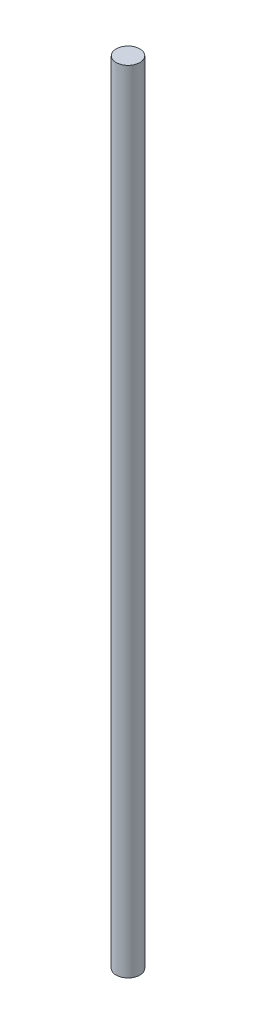
ISO-10303-21;
HEADER;
FILE_DESCRIPTION(('STEP AP214'),'2;1');
FILE_NAME('part.step','',(''),(''),'','','');
FILE_SCHEMA(('AUTOMOTIVE_DESIGN { 1 0 10303 214 1 1 1 1 }'));
ENDSEC;
DATA;
#1=APPLICATION_CONTEXT('core data for automotive mechanical design processes');
#2=APPLICATION_PROTOCOL_DEFINITION('international standard','automotive_design',2000,#1);
#3=PRODUCT_CONTEXT('',#1,'mechanical');
#4=PRODUCT('Part','Part','',(#3));
#5=PRODUCT_RELATED_PRODUCT_CATEGORY('part','',(#4));
#6=PRODUCT_DEFINITION_FORMATION('','',#4);
#7=PRODUCT_DEFINITION_CONTEXT('part definition',#1,'design');
#8=PRODUCT_DEFINITION('design','',#6,#7);
#9=PRODUCT_DEFINITION_SHAPE('','',#8);
#10=(LENGTH_UNIT() NAMED_UNIT(*) SI_UNIT(.MILLI.,.METRE.));
#11=(NAMED_UNIT(*) PLANE_ANGLE_UNIT() SI_UNIT($,.RADIAN.));
#12=(NAMED_UNIT(*) SI_UNIT($,.STERADIAN.) SOLID_ANGLE_UNIT());
#13=UNCERTAINTY_MEASURE_WITH_UNIT(LENGTH_MEASURE(1.E-05),#10,'distance_accuracy_value','');
#14=(GEOMETRIC_REPRESENTATION_CONTEXT(3) GLOBAL_UNCERTAINTY_ASSIGNED_CONTEXT((#13)) GLOBAL_UNIT_ASSIGNED_CONTEXT((#10,
#11,#12)) REPRESENTATION_CONTEXT('',''));
#15=CARTESIAN_POINT('',(0.,0.,0.));
#16=DIRECTION('',(0.,0.,1.));
#17=DIRECTION('',(1.,0.,0.));
#18=AXIS2_PLACEMENT_3D('',#15,#16,#17);
#19=CARTESIAN_POINT('',(0.,100.,0.));
#20=DIRECTION('',(0.,-1.,0.));
#21=DIRECTION('',(0.,0.,-1.));
#22=AXIS2_PLACEMENT_3D('',#19,#20,#21);
#23=CYLINDRICAL_SURFACE('',#22,3.);
#24=CARTESIAN_POINT('',(0.,100.,0.));
#25=DIRECTION('',(0.,1.,0.));
#26=DIRECTION('',(0.,0.,1.));
#27=AXIS2_PLACEMENT_3D('',#24,#25,#26);
#28=CIRCLE('',#27,3.);
#29=CARTESIAN_POINT('',(0.,100.,3.));
#30=VERTEX_POINT('',#29);
#31=EDGE_CURVE('E10',#30,#30,#28,.T.);
#32=ORIENTED_EDGE('',*,*,#31,.F.);
#33=EDGE_LOOP('',(#32));
#34=FACE_BOUND('',#33,.T.);
#35=CARTESIAN_POINT('',(0.,-100.,0.));
#36=DIRECTION('',(0.,1.,0.));
#37=DIRECTION('',(0.,0.,1.));
#38=AXIS2_PLACEMENT_3D('',#35,#36,#37);
#39=CIRCLE('',#38,3.);
#40=CARTESIAN_POINT('',(0.,-100.,3.));
#41=VERTEX_POINT('',#40);
#42=EDGE_CURVE('E37',#41,#41,#39,.T.);
#43=ORIENTED_EDGE('',*,*,#42,.T.);
#44=EDGE_LOOP('',(#43));
#45=FACE_BOUND('',#44,.T.);
#46=ADVANCED_FACE('F34',(#34,#45),#23,.T.);
#47=CARTESIAN_POINT('',(0.,100.,0.));
#48=DIRECTION('',(0.,1.,0.));
#49=DIRECTION('',(0.,0.,1.));
#50=AXIS2_PLACEMENT_3D('',#47,#48,#49);
#51=PLANE('',#50);
#52=ORIENTED_EDGE('',*,*,#31,.T.);
#53=EDGE_LOOP('',(#52));
#54=FACE_BOUND('',#53,.T.);
#55=ADVANCED_FACE('F49',(#54),#51,.T.);
#56=CARTESIAN_POINT('',(0.,-100.,0.));
#57=DIRECTION('',(0.,1.,0.));
#58=DIRECTION('',(0.,0.,1.));
#59=AXIS2_PLACEMENT_3D('',#56,#57,#58);
#60=PLANE('',#59);
#61=ORIENTED_EDGE('',*,*,#42,.F.);
#62=EDGE_LOOP('',(#61));
#63=FACE_BOUND('',#62,.T.);
#64=ADVANCED_FACE('F47',(#63),#60,.F.);
#65=CLOSED_SHELL('',(#46,#55,#64));
#66=MANIFOLD_SOLID_BREP('B2',#65);
#67=ADVANCED_BREP_SHAPE_REPRESENTATION('',(#18,#66),#14);
#68=SHAPE_DEFINITION_REPRESENTATION(#9,#67);
ENDSEC;
END-ISO-10303-21;
